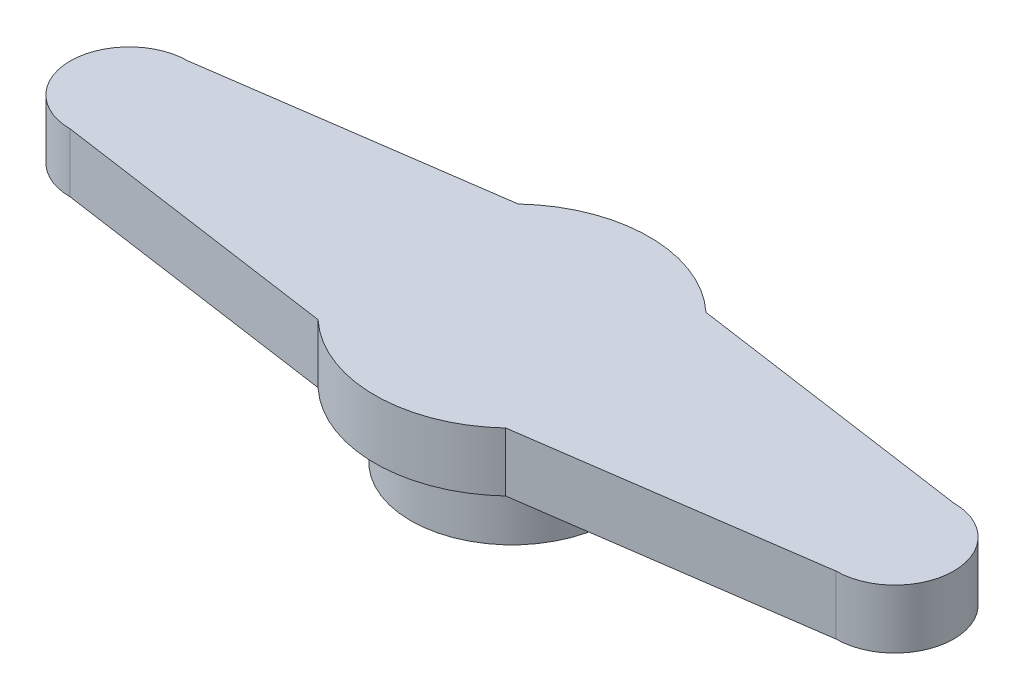
ISO-10303-21;
HEADER;
FILE_DESCRIPTION(('STEP AP214'),'2;1');
FILE_NAME('part.step','',(''),(''),'','','');
FILE_SCHEMA(('AUTOMOTIVE_DESIGN { 1 0 10303 214 1 1 1 1 }'));
ENDSEC;
DATA;
#1=APPLICATION_CONTEXT('core data for automotive mechanical design processes');
#2=APPLICATION_PROTOCOL_DEFINITION('international standard','automotive_design',2000,#1);
#3=PRODUCT_CONTEXT('',#1,'mechanical');
#4=PRODUCT('Part','Part','',(#3));
#5=PRODUCT_RELATED_PRODUCT_CATEGORY('part','',(#4));
#6=PRODUCT_DEFINITION_FORMATION('','',#4);
#7=PRODUCT_DEFINITION_CONTEXT('part definition',#1,'design');
#8=PRODUCT_DEFINITION('design','',#6,#7);
#9=PRODUCT_DEFINITION_SHAPE('','',#8);
#10=(LENGTH_UNIT() NAMED_UNIT(*) SI_UNIT(.MILLI.,.METRE.));
#11=(NAMED_UNIT(*) PLANE_ANGLE_UNIT() SI_UNIT($,.RADIAN.));
#12=(NAMED_UNIT(*) SI_UNIT($,.STERADIAN.) SOLID_ANGLE_UNIT());
#13=UNCERTAINTY_MEASURE_WITH_UNIT(LENGTH_MEASURE(1.E-05),#10,'distance_accuracy_value','');
#14=(GEOMETRIC_REPRESENTATION_CONTEXT(3) GLOBAL_UNCERTAINTY_ASSIGNED_CONTEXT((#13)) GLOBAL_UNIT_ASSIGNED_CONTEXT((#10,
#11,#12)) REPRESENTATION_CONTEXT('',''));
#15=CARTESIAN_POINT('',(0.,0.,0.));
#16=DIRECTION('',(0.,0.,1.));
#17=DIRECTION('',(1.,0.,0.));
#18=AXIS2_PLACEMENT_3D('',#15,#16,#17);
#19=CARTESIAN_POINT('',(0.,2.54,0.));
#20=DIRECTION('',(0.,-1.,0.));
#21=DIRECTION('',(0.,0.,-1.));
#22=AXIS2_PLACEMENT_3D('',#19,#20,#21);
#23=CYLINDRICAL_SURFACE('',#22,5.9182);
#24=CARTESIAN_POINT('',(0.,0.,0.));
#25=DIRECTION('',(0.,1.,0.));
#26=DIRECTION('',(0.,0.,1.));
#27=AXIS2_PLACEMENT_3D('',#24,#25,#26);
#28=CIRCLE('',#27,5.9182);
#29=CARTESIAN_POINT('',(4.04721722174632,0.,-4.318));
#30=VERTEX_POINT('',#29);
#31=CARTESIAN_POINT('',(-4.04721722174632,0.,-4.318));
#32=VERTEX_POINT('',#31);
#33=EDGE_CURVE('E148',#30,#32,#28,.T.);
#34=ORIENTED_EDGE('',*,*,#33,.T.);
#35=DIRECTION('',(0.,-1.,0.));
#36=VECTOR('',#35,1.);
#37=CARTESIAN_POINT('',(-4.04721722174632,2.54,-4.318));
#38=LINE('',#37,#36);
#39=CARTESIAN_POINT('',(-4.04721722174632,2.54,-4.318));
#40=VERTEX_POINT('',#39);
#41=EDGE_CURVE('E48',#40,#32,#38,.T.);
#42=ORIENTED_EDGE('',*,*,#41,.F.);
#43=CARTESIAN_POINT('',(0.,2.54,0.));
#44=DIRECTION('',(0.,1.,0.));
#45=DIRECTION('',(0.,0.,1.));
#46=AXIS2_PLACEMENT_3D('',#43,#44,#45);
#47=CIRCLE('',#46,5.9182);
#48=CARTESIAN_POINT('',(4.04721722174632,2.54,-4.318));
#49=VERTEX_POINT('',#48);
#50=EDGE_CURVE('E171',#49,#40,#47,.T.);
#51=ORIENTED_EDGE('',*,*,#50,.F.);
#52=DIRECTION('',(0.,-1.,0.));
#53=VECTOR('',#52,1.);
#54=CARTESIAN_POINT('',(4.04721722174632,2.54,-4.318));
#55=LINE('',#54,#53);
#56=EDGE_CURVE('E144',#49,#30,#55,.T.);
#57=ORIENTED_EDGE('',*,*,#56,.T.);
#58=EDGE_LOOP('',(#34,#42,#51,#57));
#59=FACE_BOUND('',#58,.T.);
#60=ADVANCED_FACE('F45',(#59),#23,.T.);
#61=CARTESIAN_POINT('',(-4.04721722174632,2.54,-4.318));
#62=DIRECTION('',(0.14123471506999,0.,0.989976138732191));
#63=DIRECTION('',(0.989976138732191,0.,-0.14123471506999));
#64=AXIS2_PLACEMENT_3D('',#61,#62,#63);
#65=PLANE('',#64);
#66=DIRECTION('',(-0.989976138732191,0.,0.14123471506999));
#67=VECTOR('',#66,1.);
#68=CARTESIAN_POINT('',(-4.04721722174632,0.,-4.318));
#69=LINE('',#68,#67);
#70=CARTESIAN_POINT('',(-16.51,0.,-2.54));
#71=VERTEX_POINT('',#70);
#72=EDGE_CURVE('E152',#32,#71,#69,.T.);
#73=ORIENTED_EDGE('',*,*,#72,.T.);
#74=DIRECTION('',(0.,-1.,0.));
#75=VECTOR('',#74,1.);
#76=CARTESIAN_POINT('',(-16.51,2.54,-2.54));
#77=LINE('',#76,#75);
#78=CARTESIAN_POINT('',(-16.51,2.54,-2.54));
#79=VERTEX_POINT('',#78);
#80=EDGE_CURVE('E185',#79,#71,#77,.T.);
#81=ORIENTED_EDGE('',*,*,#80,.F.);
#82=DIRECTION('',(-0.989976138732191,0.,0.14123471506999));
#83=VECTOR('',#82,1.);
#84=CARTESIAN_POINT('',(-4.04721722174632,2.54,-4.318));
#85=LINE('',#84,#83);
#86=EDGE_CURVE('E107',#40,#79,#85,.T.);
#87=ORIENTED_EDGE('',*,*,#86,.F.);
#88=ORIENTED_EDGE('',*,*,#41,.T.);
#89=EDGE_LOOP('',(#73,#81,#87,#88));
#90=FACE_BOUND('',#89,.T.);
#91=ADVANCED_FACE('F193',(#90),#65,.F.);
#92=CARTESIAN_POINT('',(-16.51,2.54,0.));
#93=DIRECTION('',(0.,-1.,0.));
#94=DIRECTION('',(0.,0.,-1.));
#95=AXIS2_PLACEMENT_3D('',#92,#93,#94);
#96=CYLINDRICAL_SURFACE('',#95,2.54);
#97=CARTESIAN_POINT('',(-16.51,0.,0.));
#98=DIRECTION('',(0.,1.,0.));
#99=DIRECTION('',(0.,0.,-1.));
#100=AXIS2_PLACEMENT_3D('',#97,#98,#99);
#101=CIRCLE('',#100,2.54);
#102=CARTESIAN_POINT('',(-16.51,0.,2.54));
#103=VERTEX_POINT('',#102);
#104=EDGE_CURVE('E156',#71,#103,#101,.T.);
#105=ORIENTED_EDGE('',*,*,#104,.T.);
#106=DIRECTION('',(0.,-1.,0.));
#107=VECTOR('',#106,1.);
#108=CARTESIAN_POINT('',(-16.51,2.54,2.54));
#109=LINE('',#108,#107);
#110=CARTESIAN_POINT('',(-16.51,2.54,2.54));
#111=VERTEX_POINT('',#110);
#112=EDGE_CURVE('E182',#111,#103,#109,.T.);
#113=ORIENTED_EDGE('',*,*,#112,.F.);
#114=CARTESIAN_POINT('',(-16.51,2.54,0.));
#115=DIRECTION('',(0.,1.,0.));
#116=DIRECTION('',(0.,0.,-1.));
#117=AXIS2_PLACEMENT_3D('',#114,#115,#116);
#118=CIRCLE('',#117,2.54);
#119=EDGE_CURVE('E209',#79,#111,#118,.T.);
#120=ORIENTED_EDGE('',*,*,#119,.F.);
#121=ORIENTED_EDGE('',*,*,#80,.T.);
#122=EDGE_LOOP('',(#105,#113,#120,#121));
#123=FACE_BOUND('',#122,.T.);
#124=ADVANCED_FACE('F202',(#123),#96,.T.);
#125=CARTESIAN_POINT('',(-4.04721722174632,2.54,4.318));
#126=DIRECTION('',(0.14123471506999,0.,-0.989976138732191));
#127=DIRECTION('',(-0.989976138732191,0.,-0.14123471506999));
#128=AXIS2_PLACEMENT_3D('',#125,#126,#127);
#129=PLANE('',#128);
#130=DIRECTION('',(0.989976138732191,0.,0.14123471506999));
#131=VECTOR('',#130,1.);
#132=CARTESIAN_POINT('',(-4.04721722174632,0.,4.318));
#133=LINE('',#132,#131);
#134=CARTESIAN_POINT('',(-4.04721722174632,0.,4.318));
#135=VERTEX_POINT('',#134);
#136=EDGE_CURVE('E159',#103,#135,#133,.T.);
#137=ORIENTED_EDGE('',*,*,#136,.T.);
#138=DIRECTION('',(0.,-1.,0.));
#139=VECTOR('',#138,1.);
#140=CARTESIAN_POINT('',(-4.04721722174632,2.54,4.318));
#141=LINE('',#140,#139);
#142=CARTESIAN_POINT('',(-4.04721722174632,2.54,4.318));
#143=VERTEX_POINT('',#142);
#144=EDGE_CURVE('E178',#143,#135,#141,.T.);
#145=ORIENTED_EDGE('',*,*,#144,.F.);
#146=DIRECTION('',(0.989976138732191,0.,0.14123471506999));
#147=VECTOR('',#146,1.);
#148=CARTESIAN_POINT('',(-4.04721722174632,2.54,4.318));
#149=LINE('',#148,#147);
#150=EDGE_CURVE('E207',#111,#143,#149,.T.);
#151=ORIENTED_EDGE('',*,*,#150,.F.);
#152=ORIENTED_EDGE('',*,*,#112,.T.);
#153=EDGE_LOOP('',(#137,#145,#151,#152));
#154=FACE_BOUND('',#153,.T.);
#155=ADVANCED_FACE('F205',(#154),#129,.F.);
#156=CARTESIAN_POINT('',(0.,2.54,0.));
#157=DIRECTION('',(0.,-1.,0.));
#158=DIRECTION('',(0.,0.,-1.));
#159=AXIS2_PLACEMENT_3D('',#156,#157,#158);
#160=CYLINDRICAL_SURFACE('',#159,5.9182);
#161=CARTESIAN_POINT('',(0.,0.,0.));
#162=DIRECTION('',(0.,1.,0.));
#163=DIRECTION('',(0.,0.,1.));
#164=AXIS2_PLACEMENT_3D('',#161,#162,#163);
#165=CIRCLE('',#164,5.9182);
#166=CARTESIAN_POINT('',(4.04721722174632,0.,4.318));
#167=VERTEX_POINT('',#166);
#168=EDGE_CURVE('E162',#135,#167,#165,.T.);
#169=ORIENTED_EDGE('',*,*,#168,.T.);
#170=DIRECTION('',(0.,-1.,0.));
#171=VECTOR('',#170,1.);
#172=CARTESIAN_POINT('',(4.04721722174632,2.54,4.318));
#173=LINE('',#172,#171);
#174=CARTESIAN_POINT('',(4.04721722174632,2.54,4.318));
#175=VERTEX_POINT('',#174);
#176=EDGE_CURVE('E137',#175,#167,#173,.T.);
#177=ORIENTED_EDGE('',*,*,#176,.F.);
#178=CARTESIAN_POINT('',(0.,2.54,0.));
#179=DIRECTION('',(0.,1.,0.));
#180=DIRECTION('',(0.,0.,1.));
#181=AXIS2_PLACEMENT_3D('',#178,#179,#180);
#182=CIRCLE('',#181,5.9182);
#183=EDGE_CURVE('E126',#143,#175,#182,.T.);
#184=ORIENTED_EDGE('',*,*,#183,.F.);
#185=ORIENTED_EDGE('',*,*,#144,.T.);
#186=EDGE_LOOP('',(#169,#177,#184,#185));
#187=FACE_BOUND('',#186,.T.);
#188=ADVANCED_FACE('F250',(#187),#160,.T.);
#189=CARTESIAN_POINT('',(4.04721722174632,2.54,4.318));
#190=DIRECTION('',(-0.14123471506999,0.,-0.989976138732191));
#191=DIRECTION('',(-0.989976138732191,0.,0.14123471506999));
#192=AXIS2_PLACEMENT_3D('',#189,#190,#191);
#193=PLANE('',#192);
#194=DIRECTION('',(0.989976138732191,0.,-0.14123471506999));
#195=VECTOR('',#194,1.);
#196=CARTESIAN_POINT('',(4.04721722174632,0.,4.318));
#197=LINE('',#196,#195);
#198=CARTESIAN_POINT('',(16.51,0.,2.54));
#199=VERTEX_POINT('',#198);
#200=EDGE_CURVE('E135',#167,#199,#197,.T.);
#201=ORIENTED_EDGE('',*,*,#200,.T.);
#202=DIRECTION('',(0.,-1.,0.));
#203=VECTOR('',#202,1.);
#204=CARTESIAN_POINT('',(16.51,2.54,2.54));
#205=LINE('',#204,#203);
#206=CARTESIAN_POINT('',(16.51,2.54,2.54));
#207=VERTEX_POINT('',#206);
#208=EDGE_CURVE('E132',#207,#199,#205,.T.);
#209=ORIENTED_EDGE('',*,*,#208,.F.);
#210=DIRECTION('',(0.989976138732191,0.,-0.14123471506999));
#211=VECTOR('',#210,1.);
#212=CARTESIAN_POINT('',(4.04721722174632,2.54,4.318));
#213=LINE('',#212,#211);
#214=EDGE_CURVE('E120',#175,#207,#213,.T.);
#215=ORIENTED_EDGE('',*,*,#214,.F.);
#216=ORIENTED_EDGE('',*,*,#176,.T.);
#217=EDGE_LOOP('',(#201,#209,#215,#216));
#218=FACE_BOUND('',#217,.T.);
#219=ADVANCED_FACE('F133',(#218),#193,.F.);
#220=CARTESIAN_POINT('',(16.51,2.54,0.));
#221=DIRECTION('',(0.,-1.,0.));
#222=DIRECTION('',(0.,0.,-1.));
#223=AXIS2_PLACEMENT_3D('',#220,#221,#222);
#224=CYLINDRICAL_SURFACE('',#223,2.54);
#225=CARTESIAN_POINT('',(16.51,0.,0.));
#226=DIRECTION('',(0.,1.,0.));
#227=DIRECTION('',(0.,0.,1.));
#228=AXIS2_PLACEMENT_3D('',#225,#226,#227);
#229=CIRCLE('',#228,2.54);
#230=CARTESIAN_POINT('',(16.51,0.,-2.54));
#231=VERTEX_POINT('',#230);
#232=EDGE_CURVE('E92',#199,#231,#229,.T.);
#233=ORIENTED_EDGE('',*,*,#232,.T.);
#234=DIRECTION('',(0.,-1.,0.));
#235=VECTOR('',#234,1.);
#236=CARTESIAN_POINT('',(16.51,2.54,-2.54));
#237=LINE('',#236,#235);
#238=CARTESIAN_POINT('',(16.51,2.54,-2.54));
#239=VERTEX_POINT('',#238);
#240=EDGE_CURVE('E138',#239,#231,#237,.T.);
#241=ORIENTED_EDGE('',*,*,#240,.F.);
#242=CARTESIAN_POINT('',(16.51,2.54,0.));
#243=DIRECTION('',(0.,1.,0.));
#244=DIRECTION('',(0.,0.,1.));
#245=AXIS2_PLACEMENT_3D('',#242,#243,#244);
#246=CIRCLE('',#245,2.54);
#247=EDGE_CURVE('E124',#207,#239,#246,.T.);
#248=ORIENTED_EDGE('',*,*,#247,.F.);
#249=ORIENTED_EDGE('',*,*,#208,.T.);
#250=EDGE_LOOP('',(#233,#241,#248,#249));
#251=FACE_BOUND('',#250,.T.);
#252=ADVANCED_FACE('F140',(#251),#224,.T.);
#253=CARTESIAN_POINT('',(4.04721722174632,2.54,-4.318));
#254=DIRECTION('',(-0.14123471506999,0.,0.989976138732191));
#255=DIRECTION('',(0.989976138732191,0.,0.14123471506999));
#256=AXIS2_PLACEMENT_3D('',#253,#254,#255);
#257=PLANE('',#256);
#258=DIRECTION('',(-0.989976138732191,0.,-0.14123471506999));
#259=VECTOR('',#258,1.);
#260=CARTESIAN_POINT('',(4.04721722174632,0.,-4.318));
#261=LINE('',#260,#259);
#262=EDGE_CURVE('E98',#231,#30,#261,.T.);
#263=ORIENTED_EDGE('',*,*,#262,.T.);
#264=ORIENTED_EDGE('',*,*,#56,.F.);
#265=DIRECTION('',(-0.989976138732191,0.,-0.14123471506999));
#266=VECTOR('',#265,1.);
#267=CARTESIAN_POINT('',(4.04721722174632,2.54,-4.318));
#268=LINE('',#267,#266);
#269=EDGE_CURVE('E63',#239,#49,#268,.T.);
#270=ORIENTED_EDGE('',*,*,#269,.F.);
#271=ORIENTED_EDGE('',*,*,#240,.T.);
#272=EDGE_LOOP('',(#263,#264,#270,#271));
#273=FACE_BOUND('',#272,.T.);
#274=ADVANCED_FACE('F236',(#273),#257,.F.);
#275=CARTESIAN_POINT('',(0.,2.54,0.));
#276=DIRECTION('',(0.,1.,0.));
#277=DIRECTION('',(0.,0.,1.));
#278=AXIS2_PLACEMENT_3D('',#275,#276,#277);
#279=PLANE('',#278);
#280=ORIENTED_EDGE('',*,*,#50,.T.);
#281=ORIENTED_EDGE('',*,*,#86,.T.);
#282=ORIENTED_EDGE('',*,*,#119,.T.);
#283=ORIENTED_EDGE('',*,*,#150,.T.);
#284=ORIENTED_EDGE('',*,*,#183,.T.);
#285=ORIENTED_EDGE('',*,*,#214,.T.);
#286=ORIENTED_EDGE('',*,*,#247,.T.);
#287=ORIENTED_EDGE('',*,*,#269,.T.);
#288=EDGE_LOOP('',(#280,#281,#282,#283,#284,#285,#286,#287));
#289=FACE_BOUND('',#288,.T.);
#290=ADVANCED_FACE('F122',(#289),#279,.T.);
#291=CARTESIAN_POINT('',(0.,0.,0.));
#292=DIRECTION('',(0.,1.,0.));
#293=DIRECTION('',(0.,0.,1.));
#294=AXIS2_PLACEMENT_3D('',#291,#292,#293);
#295=PLANE('',#294);
#296=CARTESIAN_POINT('',(0.,0.,0.));
#297=DIRECTION('',(0.,-1.,0.));
#298=DIRECTION('',(0.,0.,-1.));
#299=AXIS2_PLACEMENT_3D('',#296,#297,#298);
#300=CIRCLE('',#299,4.3688);
#301=CARTESIAN_POINT('',(0.,0.,-4.3688));
#302=VERTEX_POINT('',#301);
#303=EDGE_CURVE('E11',#302,#302,#300,.T.);
#304=ORIENTED_EDGE('',*,*,#303,.F.);
#305=EDGE_LOOP('',(#304));
#306=FACE_BOUND('',#305,.T.);
#307=ORIENTED_EDGE('',*,*,#33,.F.);
#308=ORIENTED_EDGE('',*,*,#262,.F.);
#309=ORIENTED_EDGE('',*,*,#232,.F.);
#310=ORIENTED_EDGE('',*,*,#200,.F.);
#311=ORIENTED_EDGE('',*,*,#168,.F.);
#312=ORIENTED_EDGE('',*,*,#136,.F.);
#313=ORIENTED_EDGE('',*,*,#104,.F.);
#314=ORIENTED_EDGE('',*,*,#72,.F.);
#315=EDGE_LOOP('',(#307,#308,#309,#310,#311,#312,#313,#314));
#316=FACE_BOUND('',#315,.T.);
#317=ADVANCED_FACE('F198',(#306,#316),#295,.F.);
#318=CARTESIAN_POINT('',(0.,-2.921,0.));
#319=DIRECTION('',(0.,1.,0.));
#320=DIRECTION('',(0.,0.,1.));
#321=AXIS2_PLACEMENT_3D('',#318,#319,#320);
#322=CYLINDRICAL_SURFACE('',#321,4.3688);
#323=CARTESIAN_POINT('',(0.,-2.921,0.));
#324=DIRECTION('',(0.,-1.,0.));
#325=DIRECTION('',(0.,0.,-1.));
#326=AXIS2_PLACEMENT_3D('',#323,#324,#325);
#327=CIRCLE('',#326,4.3688);
#328=CARTESIAN_POINT('',(0.,-2.921,-4.3688));
#329=VERTEX_POINT('',#328);
#330=EDGE_CURVE('E153',#329,#329,#327,.T.);
#331=ORIENTED_EDGE('',*,*,#330,.F.);
#332=EDGE_LOOP('',(#331));
#333=FACE_BOUND('',#332,.T.);
#334=ORIENTED_EDGE('',*,*,#303,.T.);
#335=EDGE_LOOP('',(#334));
#336=FACE_BOUND('',#335,.T.);
#337=ADVANCED_FACE('F225',(#333,#336),#322,.T.);
#338=CARTESIAN_POINT('',(0.,-2.921,0.));
#339=DIRECTION('',(0.,-1.,0.));
#340=DIRECTION('',(0.,0.,-1.));
#341=AXIS2_PLACEMENT_3D('',#338,#339,#340);
#342=PLANE('',#341);
#343=ORIENTED_EDGE('',*,*,#330,.T.);
#344=EDGE_LOOP('',(#343));
#345=FACE_BOUND('',#344,.T.);
#346=ADVANCED_FACE('F223',(#345),#342,.T.);
#347=CLOSED_SHELL('',(#60,#91,#124,#155,#188,#219,#252,#274,#290,#317,#337,#346));
#348=MANIFOLD_SOLID_BREP('B2',#347);
#349=ADVANCED_BREP_SHAPE_REPRESENTATION('',(#18,#348),#14);
#350=SHAPE_DEFINITION_REPRESENTATION(#9,#349);
ENDSEC;
END-ISO-10303-21;
